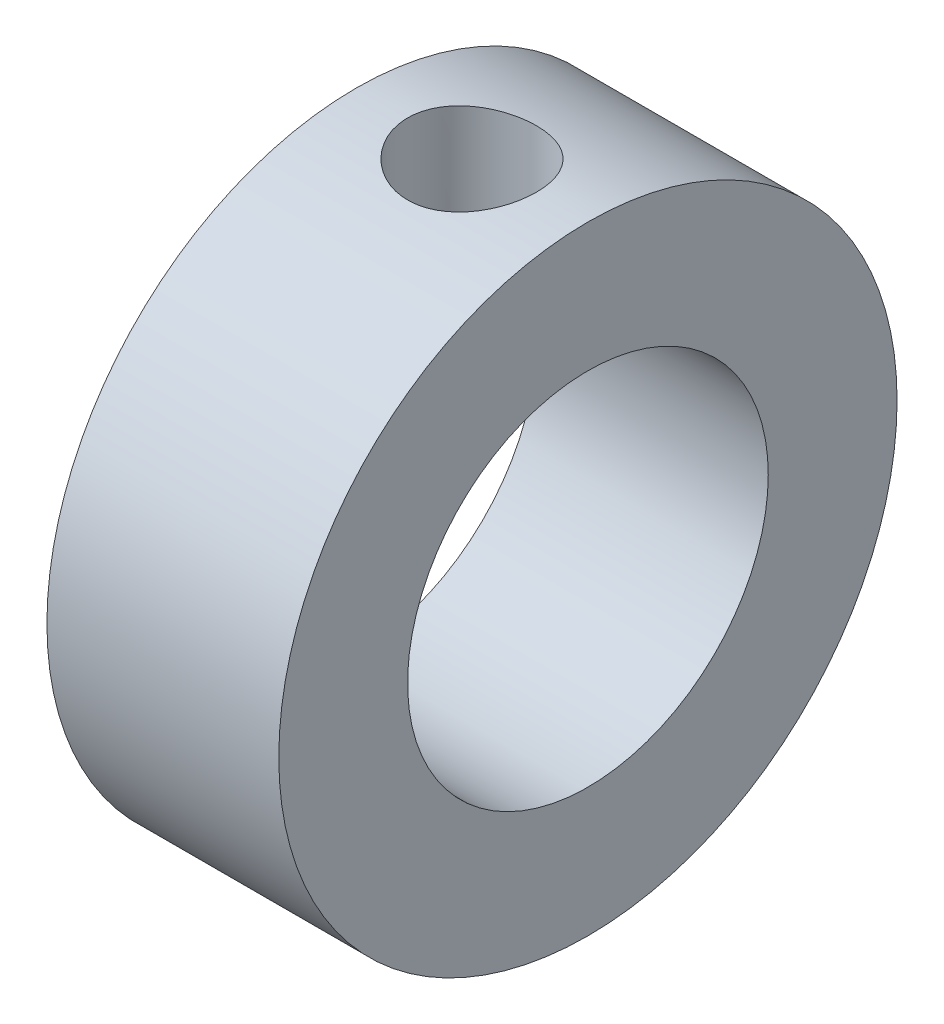
ISO-10303-21;
HEADER;
FILE_DESCRIPTION(('STEP AP214'),'2;1');
FILE_NAME('part.step','',(''),(''),'','','');
FILE_SCHEMA(('AUTOMOTIVE_DESIGN { 1 0 10303 214 1 1 1 1 }'));
ENDSEC;
DATA;
#1=APPLICATION_CONTEXT('core data for automotive mechanical design processes');
#2=APPLICATION_PROTOCOL_DEFINITION('international standard','automotive_design',2000,#1);
#3=PRODUCT_CONTEXT('',#1,'mechanical');
#4=PRODUCT('Part','Part','',(#3));
#5=PRODUCT_RELATED_PRODUCT_CATEGORY('part','',(#4));
#6=PRODUCT_DEFINITION_FORMATION('','',#4);
#7=PRODUCT_DEFINITION_CONTEXT('part definition',#1,'design');
#8=PRODUCT_DEFINITION('design','',#6,#7);
#9=PRODUCT_DEFINITION_SHAPE('','',#8);
#10=(LENGTH_UNIT() NAMED_UNIT(*) SI_UNIT(.MILLI.,.METRE.));
#11=(NAMED_UNIT(*) PLANE_ANGLE_UNIT() SI_UNIT($,.RADIAN.));
#12=(NAMED_UNIT(*) SI_UNIT($,.STERADIAN.) SOLID_ANGLE_UNIT());
#13=UNCERTAINTY_MEASURE_WITH_UNIT(LENGTH_MEASURE(1.E-05),#10,'distance_accuracy_value','');
#14=(GEOMETRIC_REPRESENTATION_CONTEXT(3) GLOBAL_UNCERTAINTY_ASSIGNED_CONTEXT((#13)) GLOBAL_UNIT_ASSIGNED_CONTEXT((#10,
#11,#12)) REPRESENTATION_CONTEXT('',''));
#15=CARTESIAN_POINT('',(0.,0.,0.));
#16=DIRECTION('',(0.,0.,1.));
#17=DIRECTION('',(1.,0.,0.));
#18=AXIS2_PLACEMENT_3D('',#15,#16,#17);
#19=CARTESIAN_POINT('',(-7.14375,0.,0.));
#20=DIRECTION('',(1.,0.,0.));
#21=DIRECTION('',(0.,0.,-1.));
#22=AXIS2_PLACEMENT_3D('',#19,#20,#21);
#23=CYLINDRICAL_SURFACE('',#22,11.1125);
#24=CARTESIAN_POINT('',(7.14375,0.,0.));
#25=DIRECTION('',(1.,0.,0.));
#26=DIRECTION('',(0.,0.,-1.));
#27=AXIS2_PLACEMENT_3D('',#24,#25,#26);
#28=CIRCLE('',#27,11.1125);
#29=CARTESIAN_POINT('',(7.14375,0.,-11.1125));
#30=VERTEX_POINT('',#29);
#31=EDGE_CURVE('E55',#30,#30,#28,.F.);
#32=ORIENTED_EDGE('',*,*,#31,.F.);
#33=EDGE_LOOP('',(#32));
#34=FACE_BOUND('',#33,.T.);
#35=CARTESIAN_POINT('',(0.,10.3796281093062,3.96875));
#36=CARTESIAN_POINT('',(0.107462766247114,10.3796280499209,3.96875004982341));
#37=CARTESIAN_POINT('',(0.214924244513253,10.3813016916018,3.96438131804466));
#38=CARTESIAN_POINT('',(0.429074077198358,10.3879412553232,3.94695058084497));
#39=CARTESIAN_POINT('',(0.53576213756945,10.3929083693167,3.93388542806273));
#40=CARTESIAN_POINT('',(0.747674772736393,10.4059841264592,3.89916608154148));
#41=CARTESIAN_POINT('',(0.852897395786063,10.414096608491,3.87750139140171));
#42=CARTESIAN_POINT('',(1.06101165263033,10.4331997767811,3.82580039547942));
#43=CARTESIAN_POINT('',(1.16390234755741,10.4441916006976,3.79576078037345));
#44=CARTESIAN_POINT('',(1.46734792341463,10.4809218302475,3.69367260625314));
#45=CARTESIAN_POINT('',(1.66351913731488,10.5104711579668,3.60951464142585));
#46=CARTESIAN_POINT('',(2.03885440859858,10.5763562148896,3.41162033580728));
#47=CARTESIAN_POINT('',(2.21801918234287,10.6126916580505,3.29788524164627));
#48=CARTESIAN_POINT('',(2.56256219111373,10.6899051650783,3.03851912266185));
#49=CARTESIAN_POINT('',(2.72707312854676,10.7309084444169,2.89177086132482));
#50=CARTESIAN_POINT('',(3.02975078468578,10.8117873083062,2.57292352108778));
#51=CARTESIAN_POINT('',(3.16791129534975,10.8516626252341,2.40081848513223));
#52=CARTESIAN_POINT('',(3.41802835056234,10.9272562018545,2.02968356525441));
#53=CARTESIAN_POINT('',(3.52905940043048,10.9628110053615,1.82999364244433));
#54=CARTESIAN_POINT('',(3.7155997840714,11.0242716907628,1.41327933052917));
#55=CARTESIAN_POINT('',(3.79112029888222,11.0501806092766,1.19626042293212));
#56=CARTESIAN_POINT('',(3.9015049667611,11.0885456040034,0.760140588773363));
#57=CARTESIAN_POINT('',(3.93785656028704,11.1014924277521,0.541460142809277));
#58=CARTESIAN_POINT('',(3.9736210696061,11.1142271656252,0.100745417008487));
#59=CARTESIAN_POINT('',(3.97304489727374,11.1140189669591,-0.121287852706261));
#60=CARTESIAN_POINT('',(3.935871045904,11.1007884061209,-0.551802512276378));
#61=CARTESIAN_POINT('',(3.90089337681918,11.0883423470948,-0.760444497355141));
#62=CARTESIAN_POINT('',(3.79861316929704,11.0527759582007,-1.16867581980744));
#63=CARTESIAN_POINT('',(3.73130826317423,11.029654846484,-1.36826449293355));
#64=CARTESIAN_POINT('',(3.56544915365892,10.9746489802285,-1.75603488641088));
#65=CARTESIAN_POINT('',(3.46646932223273,10.9426456989342,-1.94401702000243));
#66=CARTESIAN_POINT('',(3.2404297821228,10.8731562430135,-2.3011461880971));
#67=CARTESIAN_POINT('',(3.11336284317142,10.8356686574428,-2.47028835586803));
#68=CARTESIAN_POINT('',(2.82684479646944,10.7567544173895,-2.79449734090259));
#69=CARTESIAN_POINT('',(2.66602703282149,10.7152243136397,-2.94833076148177));
#70=CARTESIAN_POINT('',(2.32040399970408,10.6345113610355,-3.22738067498967));
#71=CARTESIAN_POINT('',(2.13558623975753,10.5953297500512,-3.35258217247734));
#72=CARTESIAN_POINT('',(1.84213913358771,10.5413764448935,-3.51716612853762));
#73=CARTESIAN_POINT('',(1.74053350984615,10.5240489040832,-3.5685456064176));
#74=CARTESIAN_POINT('',(1.53298786299047,10.491722814141,-3.66249609505262));
#75=CARTESIAN_POINT('',(1.42704969112831,10.4767232831446,-3.70507082184412));
#76=CARTESIAN_POINT('',(1.21175336288965,10.4495759665204,-3.78095781223323));
#77=CARTESIAN_POINT('',(1.10240110151031,10.4374235434124,-3.8142851548882));
#78=CARTESIAN_POINT('',(0.880977591995911,10.4163653158826,-3.8714233494849));
#79=CARTESIAN_POINT('',(0.768907609895291,10.407458029583,-3.89523854558678));
#80=CARTESIAN_POINT('',(0.547734662763467,10.3935093183184,-3.93230150024073));
#81=CARTESIAN_POINT('',(0.43870928014687,10.3883190908151,-3.94595698618953));
#82=CARTESIAN_POINT('',(0.21978881776556,10.3813785115807,-3.96418122404664));
#83=CARTESIAN_POINT('',(0.109893735426677,10.3796281700349,-3.96874994904951));
#84=CARTESIAN_POINT('',(-0.107462766247113,10.3796280499209,-3.96875004982341));
#85=CARTESIAN_POINT('',(-0.214924244513252,10.3813016916018,-3.96438131804466));
#86=CARTESIAN_POINT('',(-0.429074077198357,10.3879412553232,-3.94695058084497));
#87=CARTESIAN_POINT('',(-0.535762137569449,10.3929083693167,-3.93388542806273));
#88=CARTESIAN_POINT('',(-0.747674772736392,10.4059841264592,-3.89916608154148));
#89=CARTESIAN_POINT('',(-0.852897395786063,10.414096608491,-3.87750139140171));
#90=CARTESIAN_POINT('',(-1.06101165263033,10.4331997767811,-3.82580039547942));
#91=CARTESIAN_POINT('',(-1.16390234755741,10.4441916006976,-3.79576078037345));
#92=CARTESIAN_POINT('',(-1.46734792341463,10.4809218302475,-3.69367260625314));
#93=CARTESIAN_POINT('',(-1.66351913731488,10.5104711579668,-3.60951464142585));
#94=CARTESIAN_POINT('',(-2.03885440859858,10.5763562148896,-3.41162033580728));
#95=CARTESIAN_POINT('',(-2.21801918234287,10.6126916580505,-3.29788524164627));
#96=CARTESIAN_POINT('',(-2.56256219111373,10.6899051650783,-3.03851912266185));
#97=CARTESIAN_POINT('',(-2.72707312854676,10.7309084444169,-2.89177086132482));
#98=CARTESIAN_POINT('',(-3.02975078468578,10.8117873083062,-2.57292352108778));
#99=CARTESIAN_POINT('',(-3.16791129534975,10.8516626252341,-2.40081848513223));
#100=CARTESIAN_POINT('',(-3.41802835056234,10.9272562018545,-2.02968356525441));
#101=CARTESIAN_POINT('',(-3.52905940043048,10.9628110053615,-1.82999364244433));
#102=CARTESIAN_POINT('',(-3.7155997840714,11.0242716907628,-1.41327933052917));
#103=CARTESIAN_POINT('',(-3.79112029888222,11.0501806092766,-1.19626042293212));
#104=CARTESIAN_POINT('',(-3.9015049667611,11.0885456040034,-0.760140588773364));
#105=CARTESIAN_POINT('',(-3.93785656028704,11.1014924277521,-0.541460142809278));
#106=CARTESIAN_POINT('',(-3.9736210696061,11.1142271656252,-0.100745417008488));
#107=CARTESIAN_POINT('',(-3.97304489727374,11.1140189669591,0.121287852706261));
#108=CARTESIAN_POINT('',(-3.935871045904,11.1007884061209,0.551802512276379));
#109=CARTESIAN_POINT('',(-3.90089337681918,11.0883423470948,0.760444497355142));
#110=CARTESIAN_POINT('',(-3.79861316929704,11.0527759582007,1.16867581980744));
#111=CARTESIAN_POINT('',(-3.73130826317422,11.029654846484,1.36826449293355));
#112=CARTESIAN_POINT('',(-3.56544915365892,10.9746489802285,1.75603488641088));
#113=CARTESIAN_POINT('',(-3.46646932223273,10.9426456989342,1.94401702000243));
#114=CARTESIAN_POINT('',(-3.2404297821228,10.8731562430135,2.3011461880971));
#115=CARTESIAN_POINT('',(-3.11336284317142,10.8356686574428,2.47028835586803));
#116=CARTESIAN_POINT('',(-2.82684479646944,10.7567544173895,2.79449734090259));
#117=CARTESIAN_POINT('',(-2.66602703282149,10.7152243136396,2.94833076148177));
#118=CARTESIAN_POINT('',(-2.32040399970407,10.6345113610355,3.22738067498967));
#119=CARTESIAN_POINT('',(-2.13558623975753,10.5953297500512,3.35258217247734));
#120=CARTESIAN_POINT('',(-1.84213913358771,10.5413764448935,3.51716612853762));
#121=CARTESIAN_POINT('',(-1.74053350984615,10.5240489040832,3.5685456064176));
#122=CARTESIAN_POINT('',(-1.53298786299047,10.491722814141,3.66249609505261));
#123=CARTESIAN_POINT('',(-1.42704969112831,10.4767232831446,3.70507082184412));
#124=CARTESIAN_POINT('',(-1.21175336288965,10.4495759665204,3.78095781223323));
#125=CARTESIAN_POINT('',(-1.10240110151031,10.4374235434124,3.8142851548882));
#126=CARTESIAN_POINT('',(-0.880977591995912,10.4163653158826,3.8714233494849));
#127=CARTESIAN_POINT('',(-0.768907609895292,10.407458029583,3.89523854558678));
#128=CARTESIAN_POINT('',(-0.547734662763468,10.3935093183184,3.93230150024073));
#129=CARTESIAN_POINT('',(-0.438709280146871,10.3883190908151,3.94595698618953));
#130=CARTESIAN_POINT('',(-0.219788817765561,10.3813785115807,3.96418122404664));
#131=CARTESIAN_POINT('',(-0.109893735426678,10.3796281700349,3.96874994904951));
#132=CARTESIAN_POINT('',(0.,10.3796281093062,3.96875));
#133=B_SPLINE_CURVE_WITH_KNOTS('',3,(#35,#36,#37,#38,#39,#40,#41,#42,#43,#44,#45,#46,#47,#48,
#49,#50,#51,#52,#53,#54,#55,#56,#57,#58,#59,#60,#61,#62,#63,#64,#65,#66,#67,#68,#69,#70,#71,#72,
#73,#74,#75,#76,#77,#78,#79,#80,#81,#82,#83,#84,#85,#86,#87,#88,#89,#90,#91,#92,#93,#94,#95,#96,
#97,#98,#99,#100,#101,#102,#103,#104,#105,#106,#107,#108,#109,#110,#111,#112,#113,#114,#115,
#116,#117,#118,#119,#120,#121,#122,#123,#124,#125,#126,#127,#128,#129,#130,#131,#132),
.UNSPECIFIED.,.T.,.F.,(4,2,2,2,2,2,2,2,2,2,2,2,2,2,2,2,2,2,2,2,2,2,2,2,2,2,2,2,2,2,2,2,2,2,2,2,
2,2,2,2,2,2,2,2,2,2,2,2,4),(0.,0.322284123277768,0.644684949335372,0.967480506601574,
1.2904037966724,1.93371402747028,2.57699714812979,3.24667460467471,3.9165096398489,
4.60673111166098,5.29673511085952,5.9594969787499,6.6220630064421,7.25485258580658,
7.88768851850517,8.52941281198655,9.17130249284798,9.84745817561753,10.5239671755503,
10.8691073566232,11.2141015730044,11.5585298806287,11.9028007088383,12.2323744071998,
12.5619490814108,12.8842332046886,13.2066340307462,13.5294295880124,13.8523528780832,
14.4956631088811,15.1389462295406,15.8086236860855,16.4784587212597,17.1686801930718,
17.8586841922703,18.5214460601607,19.1840120878529,19.8168016672174,20.449637599916,
21.0913618933973,21.7332515742588,22.4094072570283,23.0859162569611,23.431056438034,
23.7760506544152,24.1204789620395,24.4647497902491,24.7943234886106,25.1238981628216),.UNSPECIFIED.);
#134=CARTESIAN_POINT('',(0.,10.3796281093062,3.96875));
#135=VERTEX_POINT('',#134);
#136=EDGE_CURVE('E53',#135,#135,#133,.T.);
#137=ORIENTED_EDGE('',*,*,#136,.T.);
#138=EDGE_LOOP('',(#137));
#139=FACE_BOUND('',#138,.T.);
#140=CARTESIAN_POINT('',(-7.14375,0.,0.));
#141=DIRECTION('',(1.,0.,0.));
#142=DIRECTION('',(0.,0.,-1.));
#143=AXIS2_PLACEMENT_3D('',#140,#141,#142);
#144=CIRCLE('',#143,11.1125);
#145=CARTESIAN_POINT('',(-7.14375,0.,-11.1125));
#146=VERTEX_POINT('',#145);
#147=EDGE_CURVE('E19',#146,#146,#144,.F.);
#148=ORIENTED_EDGE('',*,*,#147,.T.);
#149=EDGE_LOOP('',(#148));
#150=FACE_BOUND('',#149,.T.);
#151=ADVANCED_FACE('F15',(#34,#139,#150),#23,.F.);
#152=CARTESIAN_POINT('',(-7.14375,0.,0.));
#153=DIRECTION('',(1.,0.,0.));
#154=DIRECTION('',(0.,0.,-1.));
#155=AXIS2_PLACEMENT_3D('',#152,#153,#154);
#156=PLANE('',#155);
#157=ORIENTED_EDGE('',*,*,#147,.F.);
#158=EDGE_LOOP('',(#157));
#159=FACE_BOUND('',#158,.T.);
#160=CARTESIAN_POINT('',(-7.14375,0.,0.));
#161=DIRECTION('',(1.,0.,0.));
#162=DIRECTION('',(0.,0.,-1.));
#163=AXIS2_PLACEMENT_3D('',#160,#161,#162);
#164=CIRCLE('',#163,19.05);
#165=CARTESIAN_POINT('',(-7.14375,0.,-19.05));
#166=VERTEX_POINT('',#165);
#167=EDGE_CURVE('E28',#166,#166,#164,.T.);
#168=ORIENTED_EDGE('',*,*,#167,.F.);
#169=EDGE_LOOP('',(#168));
#170=FACE_BOUND('',#169,.T.);
#171=ADVANCED_FACE('F66',(#159,#170),#156,.F.);
#172=CARTESIAN_POINT('',(7.14375,0.,0.));
#173=DIRECTION('',(1.,0.,0.));
#174=DIRECTION('',(0.,0.,-1.));
#175=AXIS2_PLACEMENT_3D('',#172,#173,#174);
#176=PLANE('',#175);
#177=ORIENTED_EDGE('',*,*,#31,.T.);
#178=EDGE_LOOP('',(#177));
#179=FACE_BOUND('',#178,.T.);
#180=CARTESIAN_POINT('',(7.14375,0.,0.));
#181=DIRECTION('',(1.,0.,0.));
#182=DIRECTION('',(0.,0.,-1.));
#183=AXIS2_PLACEMENT_3D('',#180,#181,#182);
#184=CIRCLE('',#183,19.05);
#185=CARTESIAN_POINT('',(7.14375,0.,-19.05));
#186=VERTEX_POINT('',#185);
#187=EDGE_CURVE('E23',#186,#186,#184,.F.);
#188=ORIENTED_EDGE('',*,*,#187,.F.);
#189=EDGE_LOOP('',(#188));
#190=FACE_BOUND('',#189,.T.);
#191=ADVANCED_FACE('F45',(#179,#190),#176,.T.);
#192=CARTESIAN_POINT('',(0.,0.,0.));
#193=DIRECTION('',(0.,-1.,0.));
#194=DIRECTION('',(0.,0.,-1.));
#195=AXIS2_PLACEMENT_3D('',#192,#193,#194);
#196=CYLINDRICAL_SURFACE('',#195,3.96875);
#197=ORIENTED_EDGE('',*,*,#136,.F.);
#198=EDGE_LOOP('',(#197));
#199=FACE_BOUND('',#198,.T.);
#200=CARTESIAN_POINT('',(0.,18.63200266846,-3.96875));
#201=CARTESIAN_POINT('',(0.110088020673127,18.6320029655721,-3.96874943275146));
#202=CARTESIAN_POINT('',(0.220189248495927,18.6329810833151,-3.96416526511284));
#203=CARTESIAN_POINT('',(0.439635991611037,18.6368654831859,-3.94586235235071));
#204=CARTESIAN_POINT('',(0.548981145066303,18.6397726315965,-3.93213950324751));
#205=CARTESIAN_POINT('',(0.766265632702165,18.6474365404293,-3.89563362645665));
#206=CARTESIAN_POINT('',(0.874202529660974,18.6521961560178,-3.87283661172171));
#207=CARTESIAN_POINT('',(1.08773626116042,18.663421185054,-3.81837281511761));
#208=CARTESIAN_POINT('',(1.19333218576504,18.6698872496196,-3.78670264729505));
#209=CARTESIAN_POINT('',(1.50508426956731,18.6915508172009,-3.67884259900135));
#210=CARTESIAN_POINT('',(1.70677390962956,18.7090352398934,-3.58970671288324));
#211=CARTESIAN_POINT('',(2.09216911209465,18.7481144371838,-3.37965036793225));
#212=CARTESIAN_POINT('',(2.27588031186658,18.7697079170405,-3.25873991652801));
#213=CARTESIAN_POINT('',(2.62315650132111,18.8149518457354,-2.98652651982191));
#214=CARTESIAN_POINT('',(2.7864065715696,18.8386266792925,-2.83482513065731));
#215=CARTESIAN_POINT('',(3.08533657015551,18.8851517805338,-2.50619899696919));
#216=CARTESIAN_POINT('',(3.22101300267922,18.9080019433639,-2.32927105903062));
#217=CARTESIAN_POINT('',(3.46216554466223,18.9505633647311,-1.95313888505301));
#218=CARTESIAN_POINT('',(3.56734347820009,18.9702428473923,-1.75373955301477));
#219=CARTESIAN_POINT('',(3.74258298228132,19.0039736504816,-1.33962130455452));
#220=CARTESIAN_POINT('',(3.81264841607435,19.0180255900453,-1.12490407645356));
#221=CARTESIAN_POINT('',(3.91469795964018,19.0387474702403,-0.689492398464482));
#222=CARTESIAN_POINT('',(3.94721080546921,19.045519809916,-0.468926827216769));
#223=CARTESIAN_POINT('',(3.97488314119709,19.0512735755213,-0.0253744496571614));
#224=CARTESIAN_POINT('',(3.9700464670933,19.0502558015378,0.197612105657575));
#225=CARTESIAN_POINT('',(3.92355526972583,19.0406229144222,0.636036090367695));
#226=CARTESIAN_POINT('',(3.88247073971681,19.0321254237358,0.851536926363046));
#227=CARTESIAN_POINT('',(3.76555475718245,19.0086209905778,1.27251868716846));
#228=CARTESIAN_POINT('',(3.68972157685709,18.9936137244239,1.47799911317355));
#229=CARTESIAN_POINT('',(3.50494311379466,18.9585837591516,1.87471747901218));
#230=CARTESIAN_POINT('',(3.39577668680601,18.9385277257413,2.06584934011271));
#231=CARTESIAN_POINT('',(3.147593608294,18.8956075042061,2.42728001827068));
#232=CARTESIAN_POINT('',(3.00857540333769,18.8727431699688,2.59757775043322));
#233=CARTESIAN_POINT('',(2.70158057861957,18.8262219071913,2.91586425072105));
#234=CARTESIAN_POINT('',(2.53311056789939,18.8025581538445,3.06337570802278));
#235=CARTESIAN_POINT('',(2.17339104932551,18.7574904530785,3.32823979340221));
#236=CARTESIAN_POINT('',(1.98213148108366,18.7360875116125,3.44557902931469));
#237=CARTESIAN_POINT('',(1.68207898538877,18.7075084169283,3.59642049229359));
#238=CARTESIAN_POINT('',(1.57963033220888,18.6985539945713,3.64257920913292));
#239=CARTESIAN_POINT('',(1.37110023739717,18.6820948042917,3.72607707087794));
#240=CARTESIAN_POINT('',(1.26502023976874,18.6745894678459,3.76341967591575));
#241=CARTESIAN_POINT('',(1.05016476553089,18.6612669620313,3.82893336193631));
#242=CARTESIAN_POINT('',(0.941394081652702,18.6554469968446,3.85711964167664));
#243=CARTESIAN_POINT('',(0.721816411701117,18.6456570469612,3.90417130200974));
#244=CARTESIAN_POINT('',(0.611010421472702,18.6416861813372,3.92304112130429));
#245=CARTESIAN_POINT('',(0.416783965551369,18.6364795872628,3.94768781804423));
#246=CARTESIAN_POINT('',(0.333637410898804,18.6348033563236,3.95558248581726));
#247=CARTESIAN_POINT('',(0.166996437431142,18.6325647831308,3.96611379717082));
#248=CARTESIAN_POINT('',(0.0835020179222395,18.6320024430998,3.96875043025933));
#249=CARTESIAN_POINT('',(-0.110088020673127,18.6320029655721,3.96874943275146));
#250=CARTESIAN_POINT('',(-0.220189248495926,18.6329810833151,3.96416526511284));
#251=CARTESIAN_POINT('',(-0.439635991611036,18.6368654831859,3.94586235235071));
#252=CARTESIAN_POINT('',(-0.548981145066302,18.6397726315965,3.93213950324751));
#253=CARTESIAN_POINT('',(-0.766265632702164,18.6474365404293,3.89563362645665));
#254=CARTESIAN_POINT('',(-0.874202529660974,18.6521961560178,3.87283661172171));
#255=CARTESIAN_POINT('',(-1.08773626116042,18.663421185054,3.81837281511761));
#256=CARTESIAN_POINT('',(-1.19333218576504,18.6698872496196,3.78670264729505));
#257=CARTESIAN_POINT('',(-1.50508426956731,18.6915508172009,3.67884259900135));
#258=CARTESIAN_POINT('',(-1.70677390962956,18.7090352398934,3.58970671288324));
#259=CARTESIAN_POINT('',(-2.09216911209465,18.7481144371838,3.37965036793226));
#260=CARTESIAN_POINT('',(-2.27588031186658,18.7697079170405,3.25873991652801));
#261=CARTESIAN_POINT('',(-2.62315650132111,18.8149518457354,2.98652651982191));
#262=CARTESIAN_POINT('',(-2.7864065715696,18.8386266792925,2.83482513065731));
#263=CARTESIAN_POINT('',(-3.08533657015551,18.8851517805338,2.50619899696919));
#264=CARTESIAN_POINT('',(-3.22101300267922,18.9080019433639,2.32927105903062));
#265=CARTESIAN_POINT('',(-3.46216554466223,18.9505633647311,1.95313888505301));
#266=CARTESIAN_POINT('',(-3.56734347820009,18.9702428473923,1.75373955301477));
#267=CARTESIAN_POINT('',(-3.74258298228132,19.0039736504816,1.33962130455452));
#268=CARTESIAN_POINT('',(-3.81264841607435,19.0180255900453,1.12490407645356));
#269=CARTESIAN_POINT('',(-3.91469795964018,19.0387474702403,0.689492398464483));
#270=CARTESIAN_POINT('',(-3.94721080546921,19.045519809916,0.468926827216771));
#271=CARTESIAN_POINT('',(-3.97488314119709,19.0512735755213,0.0253744496571628));
#272=CARTESIAN_POINT('',(-3.9700464670933,19.0502558015378,-0.197612105657575));
#273=CARTESIAN_POINT('',(-3.92355526972583,19.0406229144222,-0.636036090367695));
#274=CARTESIAN_POINT('',(-3.88247073971681,19.0321254237358,-0.851536926363046));
#275=CARTESIAN_POINT('',(-3.76555475718245,19.0086209905778,-1.27251868716846));
#276=CARTESIAN_POINT('',(-3.68972157685709,18.9936137244239,-1.47799911317355));
#277=CARTESIAN_POINT('',(-3.50494311379466,18.9585837591516,-1.87471747901218));
#278=CARTESIAN_POINT('',(-3.39577668680601,18.9385277257413,-2.06584934011271));
#279=CARTESIAN_POINT('',(-3.147593608294,18.8956075042061,-2.42728001827068));
#280=CARTESIAN_POINT('',(-3.00857540333769,18.8727431699688,-2.59757775043322));
#281=CARTESIAN_POINT('',(-2.70158057861957,18.8262219071913,-2.91586425072105));
#282=CARTESIAN_POINT('',(-2.53311056789939,18.8025581538445,-3.06337570802278));
#283=CARTESIAN_POINT('',(-2.17339104932551,18.7574904530785,-3.32823979340221));
#284=CARTESIAN_POINT('',(-1.98213148108366,18.7360875116125,-3.44557902931469));
#285=CARTESIAN_POINT('',(-1.68207898538877,18.7075084169283,-3.59642049229359));
#286=CARTESIAN_POINT('',(-1.57963033220888,18.6985539945713,-3.64257920913292));
#287=CARTESIAN_POINT('',(-1.37110023739717,18.6820948042917,-3.72607707087794));
#288=CARTESIAN_POINT('',(-1.26502023976874,18.6745894678459,-3.76341967591575));
#289=CARTESIAN_POINT('',(-1.05016476553089,18.6612669620313,-3.82893336193631));
#290=CARTESIAN_POINT('',(-0.941394081652704,18.6554469968446,-3.85711964167664));
#291=CARTESIAN_POINT('',(-0.721816411701119,18.6456570469612,-3.90417130200974));
#292=CARTESIAN_POINT('',(-0.611010421472703,18.6416861813372,-3.92304112130429));
#293=CARTESIAN_POINT('',(-0.416783965551369,18.6364795872628,-3.94768781804423));
#294=CARTESIAN_POINT('',(-0.333637410898804,18.6348033563236,-3.95558248581726));
#295=CARTESIAN_POINT('',(-0.166996437431142,18.6325647831308,-3.96611379717082));
#296=CARTESIAN_POINT('',(-0.0835020179222391,18.6320024430998,-3.96875043025933));
#297=CARTESIAN_POINT('',(0.,18.63200266846,-3.96875));
#298=B_SPLINE_CURVE_WITH_KNOTS('',3,(#200,#201,#202,#203,#204,#205,#206,#207,#208,#209,#210,
#211,#212,#213,#214,#215,#216,#217,#218,#219,#220,#221,#222,#223,#224,#225,#226,#227,#228,#229,
#230,#231,#232,#233,#234,#235,#236,#237,#238,#239,#240,#241,#242,#243,#244,#245,#246,#247,#248,
#249,#250,#251,#252,#253,#254,#255,#256,#257,#258,#259,#260,#261,#262,#263,#264,#265,#266,#267,
#268,#269,#270,#271,#272,#273,#274,#275,#276,#277,#278,#279,#280,#281,#282,#283,#284,#285,#286,
#287,#288,#289,#290,#291,#292,#293,#294,#295,#296,#297),.UNSPECIFIED.,.T.,.F.,(4,2,2,2,2,2,2,2,
2,2,2,2,2,2,2,2,2,2,2,2,2,2,2,2,2,2,2,2,2,2,2,2,2,2,2,2,2,2,2,2,2,2,2,2,2,2,2,2,4),(0.,
0.33018665608083,0.660521691766649,0.991367894684242,1.32234051930866,1.98257455581435,
2.64260089969546,3.31178572332551,3.98105533403216,4.65666315827345,5.33219663249503,
5.9980980475294,6.66393107180277,7.31947692255635,7.97505537241965,8.63508130312839,
9.29514158872905,9.96755839045886,10.6402731362095,10.9781034937912,11.3158010390589,
11.6529351349464,11.9899084524726,12.2403552939077,12.4908026350913,12.8209892911721,
13.1513243268579,13.4821705297755,13.8131431543999,14.4733771909056,15.1334035347867,
15.8025883584168,16.4718579691234,17.1474657933647,17.8229992675863,18.4889006826207,
19.154733706894,19.8102795576476,20.4658580075109,21.1258839382197,21.7859442238203,
22.4583610255501,23.1310757713008,23.4689061288825,23.8066036741502,24.1437377700376,
24.4807110875639,24.731157928999,24.9816052701825),.UNSPECIFIED.);
#299=CARTESIAN_POINT('',(0.,18.63200266846,-3.96875));
#300=VERTEX_POINT('',#299);
#301=EDGE_CURVE('E10',#300,#300,#298,.T.);
#302=ORIENTED_EDGE('',*,*,#301,.F.);
#303=EDGE_LOOP('',(#302));
#304=FACE_BOUND('',#303,.T.);
#305=ADVANCED_FACE('F35',(#199,#304),#196,.F.);
#306=CARTESIAN_POINT('',(-7.14375,0.,0.));
#307=DIRECTION('',(1.,0.,0.));
#308=DIRECTION('',(0.,0.,-1.));
#309=AXIS2_PLACEMENT_3D('',#306,#307,#308);
#310=CYLINDRICAL_SURFACE('',#309,19.05);
#311=ORIENTED_EDGE('',*,*,#301,.T.);
#312=EDGE_LOOP('',(#311));
#313=FACE_BOUND('',#312,.T.);
#314=ORIENTED_EDGE('',*,*,#187,.T.);
#315=EDGE_LOOP('',(#314));
#316=FACE_BOUND('',#315,.T.);
#317=ORIENTED_EDGE('',*,*,#167,.T.);
#318=EDGE_LOOP('',(#317));
#319=FACE_BOUND('',#318,.T.);
#320=ADVANCED_FACE('F38',(#313,#316,#319),#310,.T.);
#321=CLOSED_SHELL('',(#151,#171,#191,#305,#320));
#322=MANIFOLD_SOLID_BREP('B1',#321);
#323=ADVANCED_BREP_SHAPE_REPRESENTATION('',(#18,#322),#14);
#324=SHAPE_DEFINITION_REPRESENTATION(#9,#323);
ENDSEC;
END-ISO-10303-21;
